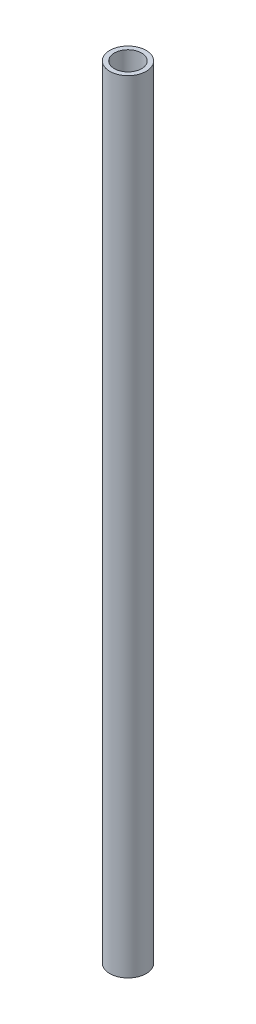
ISO-10303-21;
HEADER;
FILE_DESCRIPTION(('STEP AP214'),'2;1');
FILE_NAME('part.step','',(''),(''),'','','');
FILE_SCHEMA(('AUTOMOTIVE_DESIGN { 1 0 10303 214 1 1 1 1 }'));
ENDSEC;
DATA;
#1=APPLICATION_CONTEXT('core data for automotive mechanical design processes');
#2=APPLICATION_PROTOCOL_DEFINITION('international standard','automotive_design',2000,#1);
#3=PRODUCT_CONTEXT('',#1,'mechanical');
#4=PRODUCT('Part','Part','',(#3));
#5=PRODUCT_RELATED_PRODUCT_CATEGORY('part','',(#4));
#6=PRODUCT_DEFINITION_FORMATION('','',#4);
#7=PRODUCT_DEFINITION_CONTEXT('part definition',#1,'design');
#8=PRODUCT_DEFINITION('design','',#6,#7);
#9=PRODUCT_DEFINITION_SHAPE('','',#8);
#10=(LENGTH_UNIT() NAMED_UNIT(*) SI_UNIT(.MILLI.,.METRE.));
#11=(NAMED_UNIT(*) PLANE_ANGLE_UNIT() SI_UNIT($,.RADIAN.));
#12=(NAMED_UNIT(*) SI_UNIT($,.STERADIAN.) SOLID_ANGLE_UNIT());
#13=UNCERTAINTY_MEASURE_WITH_UNIT(LENGTH_MEASURE(1.E-05),#10,'distance_accuracy_value','');
#14=(GEOMETRIC_REPRESENTATION_CONTEXT(3) GLOBAL_UNCERTAINTY_ASSIGNED_CONTEXT((#13)) GLOBAL_UNIT_ASSIGNED_CONTEXT((#10,
#11,#12)) REPRESENTATION_CONTEXT('',''));
#15=CARTESIAN_POINT('',(0.,0.,0.));
#16=DIRECTION('',(0.,0.,1.));
#17=DIRECTION('',(1.,0.,0.));
#18=AXIS2_PLACEMENT_3D('',#15,#16,#17);
#19=CARTESIAN_POINT('',(-391.18166808322,546.1,-212.743279788072));
#20=DIRECTION('',(0.,1.,0.));
#21=DIRECTION('',(0.,0.,1.));
#22=AXIS2_PLACEMENT_3D('',#19,#20,#21);
#23=PLANE('',#22);
#24=CARTESIAN_POINT('',(-391.18166808322,546.1,-212.743279788072));
#25=DIRECTION('',(0.,1.,0.));
#26=DIRECTION('',(0.,0.,1.));
#27=AXIS2_PLACEMENT_3D('',#24,#25,#26);
#28=CIRCLE('',#27,12.7);
#29=CARTESIAN_POINT('',(-391.18166808322,546.1,-200.043279788072));
#30=VERTEX_POINT('',#29);
#31=EDGE_CURVE('E10',#30,#30,#28,.T.);
#32=ORIENTED_EDGE('',*,*,#31,.T.);
#33=EDGE_LOOP('',(#32));
#34=FACE_BOUND('',#33,.T.);
#35=CARTESIAN_POINT('',(-391.18166808322,546.1,-212.743279788072));
#36=DIRECTION('',(0.,1.,0.));
#37=DIRECTION('',(0.,0.,1.));
#38=AXIS2_PLACEMENT_3D('',#35,#36,#37);
#39=CIRCLE('',#38,9.52500000000002);
#40=CARTESIAN_POINT('',(-391.18166808322,546.1,-203.218279788071));
#41=VERTEX_POINT('',#40);
#42=EDGE_CURVE('E42',#41,#41,#39,.T.);
#43=ORIENTED_EDGE('',*,*,#42,.F.);
#44=EDGE_LOOP('',(#43));
#45=FACE_BOUND('',#44,.T.);
#46=ADVANCED_FACE('F31',(#34,#45),#23,.T.);
#47=CARTESIAN_POINT('',(-391.18166808322,0.,-212.743279788072));
#48=DIRECTION('',(0.,1.,0.));
#49=DIRECTION('',(0.,0.,1.));
#50=AXIS2_PLACEMENT_3D('',#47,#48,#49);
#51=PLANE('',#50);
#52=CARTESIAN_POINT('',(-391.18166808322,0.,-212.743279788072));
#53=DIRECTION('',(0.,1.,0.));
#54=DIRECTION('',(0.,0.,1.));
#55=AXIS2_PLACEMENT_3D('',#52,#53,#54);
#56=CIRCLE('',#55,12.7);
#57=CARTESIAN_POINT('',(-391.18166808322,0.,-200.043279788072));
#58=VERTEX_POINT('',#57);
#59=EDGE_CURVE('E35',#58,#58,#56,.T.);
#60=ORIENTED_EDGE('',*,*,#59,.F.);
#61=EDGE_LOOP('',(#60));
#62=FACE_BOUND('',#61,.T.);
#63=CARTESIAN_POINT('',(-391.18166808322,0.,-212.743279788072));
#64=DIRECTION('',(0.,1.,0.));
#65=DIRECTION('',(0.,0.,1.));
#66=AXIS2_PLACEMENT_3D('',#63,#64,#65);
#67=CIRCLE('',#66,9.52500000000002);
#68=CARTESIAN_POINT('',(-391.18166808322,0.,-203.218279788071));
#69=VERTEX_POINT('',#68);
#70=EDGE_CURVE('E44',#69,#69,#67,.T.);
#71=ORIENTED_EDGE('',*,*,#70,.T.);
#72=EDGE_LOOP('',(#71));
#73=FACE_BOUND('',#72,.T.);
#74=ADVANCED_FACE('F54',(#62,#73),#51,.F.);
#75=CARTESIAN_POINT('',(-391.18166808322,546.1,-212.743279788072));
#76=DIRECTION('',(0.,-1.,0.));
#77=DIRECTION('',(0.,0.,-1.));
#78=AXIS2_PLACEMENT_3D('',#75,#76,#77);
#79=CYLINDRICAL_SURFACE('',#78,12.7);
#80=ORIENTED_EDGE('',*,*,#31,.F.);
#81=EDGE_LOOP('',(#80));
#82=FACE_BOUND('',#81,.T.);
#83=ORIENTED_EDGE('',*,*,#59,.T.);
#84=EDGE_LOOP('',(#83));
#85=FACE_BOUND('',#84,.T.);
#86=ADVANCED_FACE('F33',(#82,#85),#79,.T.);
#87=CARTESIAN_POINT('',(-391.18166808322,546.1,-212.743279788072));
#88=DIRECTION('',(0.,-1.,0.));
#89=DIRECTION('',(0.,0.,-1.));
#90=AXIS2_PLACEMENT_3D('',#87,#88,#89);
#91=CYLINDRICAL_SURFACE('',#90,9.52500000000002);
#92=ORIENTED_EDGE('',*,*,#42,.T.);
#93=EDGE_LOOP('',(#92));
#94=FACE_BOUND('',#93,.T.);
#95=ORIENTED_EDGE('',*,*,#70,.F.);
#96=EDGE_LOOP('',(#95));
#97=FACE_BOUND('',#96,.T.);
#98=ADVANCED_FACE('F50',(#94,#97),#91,.F.);
#99=CLOSED_SHELL('',(#46,#74,#86,#98));
#100=MANIFOLD_SOLID_BREP('B2',#99);
#101=ADVANCED_BREP_SHAPE_REPRESENTATION('',(#18,#100),#14);
#102=SHAPE_DEFINITION_REPRESENTATION(#9,#101);
ENDSEC;
END-ISO-10303-21;
